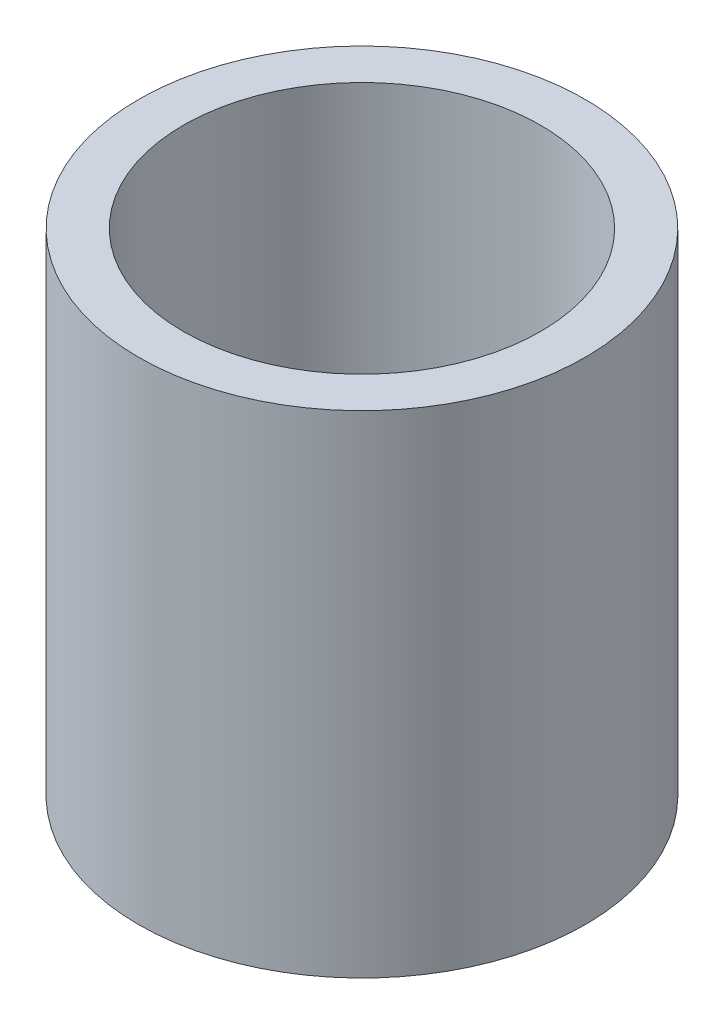
ISO-10303-21;
HEADER;
FILE_DESCRIPTION(('STEP AP214'),'2;1');
FILE_NAME('part.step','',(''),(''),'','','');
FILE_SCHEMA(('AUTOMOTIVE_DESIGN { 1 0 10303 214 1 1 1 1 }'));
ENDSEC;
DATA;
#1=APPLICATION_CONTEXT('core data for automotive mechanical design processes');
#2=APPLICATION_PROTOCOL_DEFINITION('international standard','automotive_design',2000,#1);
#3=PRODUCT_CONTEXT('',#1,'mechanical');
#4=PRODUCT('Part','Part','',(#3));
#5=PRODUCT_RELATED_PRODUCT_CATEGORY('part','',(#4));
#6=PRODUCT_DEFINITION_FORMATION('','',#4);
#7=PRODUCT_DEFINITION_CONTEXT('part definition',#1,'design');
#8=PRODUCT_DEFINITION('design','',#6,#7);
#9=PRODUCT_DEFINITION_SHAPE('','',#8);
#10=(LENGTH_UNIT() NAMED_UNIT(*) SI_UNIT(.MILLI.,.METRE.));
#11=(NAMED_UNIT(*) PLANE_ANGLE_UNIT() SI_UNIT($,.RADIAN.));
#12=(NAMED_UNIT(*) SI_UNIT($,.STERADIAN.) SOLID_ANGLE_UNIT());
#13=UNCERTAINTY_MEASURE_WITH_UNIT(LENGTH_MEASURE(1.E-05),#10,'distance_accuracy_value','');
#14=(GEOMETRIC_REPRESENTATION_CONTEXT(3) GLOBAL_UNCERTAINTY_ASSIGNED_CONTEXT((#13)) GLOBAL_UNIT_ASSIGNED_CONTEXT((#10,
#11,#12)) REPRESENTATION_CONTEXT('',''));
#15=CARTESIAN_POINT('',(0.,0.,0.));
#16=DIRECTION('',(0.,0.,1.));
#17=DIRECTION('',(1.,0.,0.));
#18=AXIS2_PLACEMENT_3D('',#15,#16,#17);
#19=CARTESIAN_POINT('',(0.,34.925,0.));
#20=DIRECTION('',(0.,1.,0.));
#21=DIRECTION('',(0.,0.,1.));
#22=AXIS2_PLACEMENT_3D('',#19,#20,#21);
#23=PLANE('',#22);
#24=CARTESIAN_POINT('',(0.,34.925,0.));
#25=DIRECTION('',(0.,1.,0.));
#26=DIRECTION('',(0.,0.,1.));
#27=AXIS2_PLACEMENT_3D('',#24,#25,#26);
#28=CIRCLE('',#27,15.875);
#29=CARTESIAN_POINT('',(0.,34.925,15.875));
#30=VERTEX_POINT('',#29);
#31=EDGE_CURVE('E10',#30,#30,#28,.T.);
#32=ORIENTED_EDGE('',*,*,#31,.T.);
#33=EDGE_LOOP('',(#32));
#34=FACE_BOUND('',#33,.T.);
#35=CARTESIAN_POINT('',(0.,34.925,0.));
#36=DIRECTION('',(0.,1.,0.));
#37=DIRECTION('',(0.,0.,1.));
#38=AXIS2_PLACEMENT_3D('',#35,#36,#37);
#39=CIRCLE('',#38,12.7);
#40=CARTESIAN_POINT('',(0.,34.925,12.7));
#41=VERTEX_POINT('',#40);
#42=EDGE_CURVE('E54',#41,#41,#39,.T.);
#43=ORIENTED_EDGE('',*,*,#42,.F.);
#44=EDGE_LOOP('',(#43));
#45=FACE_BOUND('',#44,.T.);
#46=ADVANCED_FACE('F41',(#34,#45),#23,.T.);
#47=CARTESIAN_POINT('',(0.,0.,0.));
#48=DIRECTION('',(0.,1.,0.));
#49=DIRECTION('',(0.,0.,1.));
#50=AXIS2_PLACEMENT_3D('',#47,#48,#49);
#51=PLANE('',#50);
#52=CARTESIAN_POINT('',(0.,0.,0.));
#53=DIRECTION('',(0.,1.,0.));
#54=DIRECTION('',(0.,0.,1.));
#55=AXIS2_PLACEMENT_3D('',#52,#53,#54);
#56=CIRCLE('',#55,15.875);
#57=CARTESIAN_POINT('',(0.,0.,15.875));
#58=VERTEX_POINT('',#57);
#59=EDGE_CURVE('E45',#58,#58,#56,.T.);
#60=ORIENTED_EDGE('',*,*,#59,.F.);
#61=EDGE_LOOP('',(#60));
#62=FACE_BOUND('',#61,.T.);
#63=CARTESIAN_POINT('',(0.,0.,0.));
#64=DIRECTION('',(0.,1.,0.));
#65=DIRECTION('',(0.,0.,1.));
#66=AXIS2_PLACEMENT_3D('',#63,#64,#65);
#67=CIRCLE('',#66,12.7);
#68=CARTESIAN_POINT('',(0.,0.,12.7));
#69=VERTEX_POINT('',#68);
#70=EDGE_CURVE('E56',#69,#69,#67,.T.);
#71=ORIENTED_EDGE('',*,*,#70,.T.);
#72=EDGE_LOOP('',(#71));
#73=FACE_BOUND('',#72,.T.);
#74=ADVANCED_FACE('F68',(#62,#73),#51,.F.);
#75=CARTESIAN_POINT('',(0.,34.925,0.));
#76=DIRECTION('',(0.,-1.,0.));
#77=DIRECTION('',(0.,0.,-1.));
#78=AXIS2_PLACEMENT_3D('',#75,#76,#77);
#79=CYLINDRICAL_SURFACE('',#78,15.875);
#80=ORIENTED_EDGE('',*,*,#31,.F.);
#81=EDGE_LOOP('',(#80));
#82=FACE_BOUND('',#81,.T.);
#83=ORIENTED_EDGE('',*,*,#59,.T.);
#84=EDGE_LOOP('',(#83));
#85=FACE_BOUND('',#84,.T.);
#86=ADVANCED_FACE('F43',(#82,#85),#79,.T.);
#87=CARTESIAN_POINT('',(0.,34.925,0.));
#88=DIRECTION('',(0.,-1.,0.));
#89=DIRECTION('',(0.,0.,-1.));
#90=AXIS2_PLACEMENT_3D('',#87,#88,#89);
#91=CYLINDRICAL_SURFACE('',#90,12.7);
#92=ORIENTED_EDGE('',*,*,#42,.T.);
#93=EDGE_LOOP('',(#92));
#94=FACE_BOUND('',#93,.T.);
#95=ORIENTED_EDGE('',*,*,#70,.F.);
#96=EDGE_LOOP('',(#95));
#97=FACE_BOUND('',#96,.T.);
#98=ADVANCED_FACE('F64',(#94,#97),#91,.F.);
#99=CLOSED_SHELL('',(#46,#74,#86,#98));
#100=MANIFOLD_SOLID_BREP('B2',#99);
#101=ADVANCED_BREP_SHAPE_REPRESENTATION('',(#18,#100),#14);
#102=SHAPE_DEFINITION_REPRESENTATION(#9,#101);
ENDSEC;
END-ISO-10303-21;
